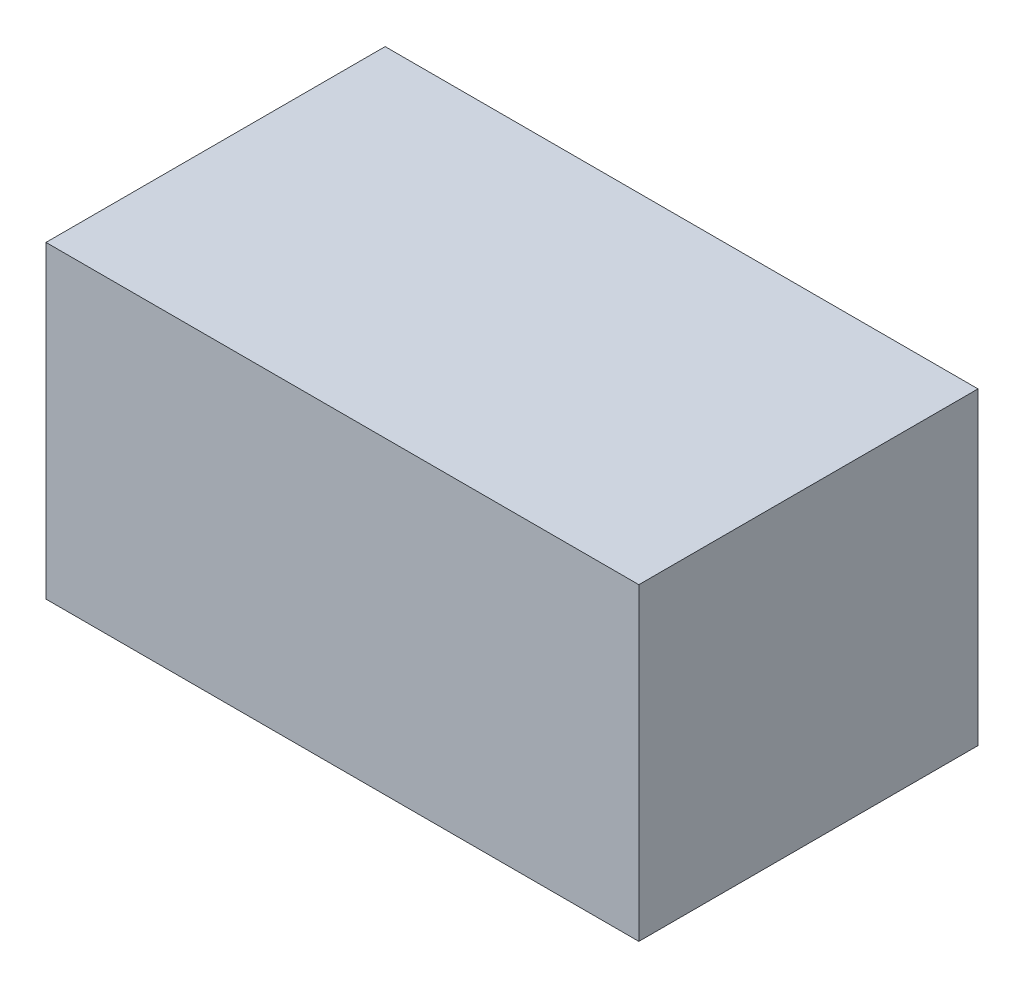
ISO-10303-21;
HEADER;
FILE_DESCRIPTION(('STEP AP214'),'2;1');
FILE_NAME('part.step','',(''),(''),'','','');
FILE_SCHEMA(('AUTOMOTIVE_DESIGN { 1 0 10303 214 1 1 1 1 }'));
ENDSEC;
DATA;
#1=APPLICATION_CONTEXT('core data for automotive mechanical design processes');
#2=APPLICATION_PROTOCOL_DEFINITION('international standard','automotive_design',2000,#1);
#3=PRODUCT_CONTEXT('',#1,'mechanical');
#4=PRODUCT('Part','Part','',(#3));
#5=PRODUCT_RELATED_PRODUCT_CATEGORY('part','',(#4));
#6=PRODUCT_DEFINITION_FORMATION('','',#4);
#7=PRODUCT_DEFINITION_CONTEXT('part definition',#1,'design');
#8=PRODUCT_DEFINITION('design','',#6,#7);
#9=PRODUCT_DEFINITION_SHAPE('','',#8);
#10=(LENGTH_UNIT() NAMED_UNIT(*) SI_UNIT(.MILLI.,.METRE.));
#11=(NAMED_UNIT(*) PLANE_ANGLE_UNIT() SI_UNIT($,.RADIAN.));
#12=(NAMED_UNIT(*) SI_UNIT($,.STERADIAN.) SOLID_ANGLE_UNIT());
#13=UNCERTAINTY_MEASURE_WITH_UNIT(LENGTH_MEASURE(1.E-05),#10,'distance_accuracy_value','');
#14=(GEOMETRIC_REPRESENTATION_CONTEXT(3) GLOBAL_UNCERTAINTY_ASSIGNED_CONTEXT((#13)) GLOBAL_UNIT_ASSIGNED_CONTEXT((#10,
#11,#12)) REPRESENTATION_CONTEXT('',''));
#15=CARTESIAN_POINT('',(0.,0.,0.));
#16=DIRECTION('',(0.,0.,1.));
#17=DIRECTION('',(1.,0.,0.));
#18=AXIS2_PLACEMENT_3D('',#15,#16,#17);
#19=CARTESIAN_POINT('',(-41.1232394366197,35.8,-16.9814788732394));
#20=DIRECTION('',(0.,0.,-1.));
#21=DIRECTION('',(-1.,0.,0.));
#22=AXIS2_PLACEMENT_3D('',#19,#20,#21);
#23=PLANE('',#22);
#24=DIRECTION('',(1.,0.,0.));
#25=VECTOR('',#24,1.);
#26=CARTESIAN_POINT('',(-41.1232394366197,0.,-16.9814788732394));
#27=LINE('',#26,#25);
#28=CARTESIAN_POINT('',(-41.1232394366197,0.,-16.9814788732394));
#29=VERTEX_POINT('',#28);
#30=CARTESIAN_POINT('',(27.5767605633803,0.,-16.9814788732394));
#31=VERTEX_POINT('',#30);
#32=EDGE_CURVE('E110',#29,#31,#27,.T.);
#33=ORIENTED_EDGE('',*,*,#32,.F.);
#34=DIRECTION('',(0.,-1.,0.));
#35=VECTOR('',#34,1.);
#36=CARTESIAN_POINT('',(-41.1232394366197,35.8,-16.9814788732394));
#37=LINE('',#36,#35);
#38=CARTESIAN_POINT('',(-41.1232394366197,35.8,-16.9814788732394));
#39=VERTEX_POINT('',#38);
#40=EDGE_CURVE('E11',#39,#29,#37,.T.);
#41=ORIENTED_EDGE('',*,*,#40,.F.);
#42=DIRECTION('',(1.,0.,0.));
#43=VECTOR('',#42,1.);
#44=CARTESIAN_POINT('',(-41.1232394366197,35.8,-16.9814788732394));
#45=LINE('',#44,#43);
#46=CARTESIAN_POINT('',(27.5767605633803,35.8,-16.9814788732394));
#47=VERTEX_POINT('',#46);
#48=EDGE_CURVE('E103',#39,#47,#45,.T.);
#49=ORIENTED_EDGE('',*,*,#48,.T.);
#50=DIRECTION('',(0.,-1.,0.));
#51=VECTOR('',#50,1.);
#52=CARTESIAN_POINT('',(27.5767605633803,35.8,-16.9814788732394));
#53=LINE('',#52,#51);
#54=EDGE_CURVE('E42',#47,#31,#53,.T.);
#55=ORIENTED_EDGE('',*,*,#54,.T.);
#56=EDGE_LOOP('',(#33,#41,#49,#55));
#57=FACE_BOUND('',#56,.T.);
#58=ADVANCED_FACE('F39',(#57),#23,.T.);
#59=CARTESIAN_POINT('',(-41.1232394366197,35.8,-16.9814788732394));
#60=DIRECTION('',(1.,0.,0.));
#61=DIRECTION('',(0.,0.,-1.));
#62=AXIS2_PLACEMENT_3D('',#59,#60,#61);
#63=PLANE('',#62);
#64=DIRECTION('',(0.,0.,1.));
#65=VECTOR('',#64,1.);
#66=CARTESIAN_POINT('',(-41.1232394366197,0.,-16.9814788732394));
#67=LINE('',#66,#65);
#68=CARTESIAN_POINT('',(-41.1232394366197,0.,22.3185211267606));
#69=VERTEX_POINT('',#68);
#70=EDGE_CURVE('E73',#29,#69,#67,.T.);
#71=ORIENTED_EDGE('',*,*,#70,.T.);
#72=DIRECTION('',(0.,-1.,0.));
#73=VECTOR('',#72,1.);
#74=CARTESIAN_POINT('',(-41.1232394366197,35.8,22.3185211267606));
#75=LINE('',#74,#73);
#76=CARTESIAN_POINT('',(-41.1232394366197,35.8,22.3185211267606));
#77=VERTEX_POINT('',#76);
#78=EDGE_CURVE('E49',#77,#69,#75,.T.);
#79=ORIENTED_EDGE('',*,*,#78,.F.);
#80=DIRECTION('',(0.,0.,1.));
#81=VECTOR('',#80,1.);
#82=CARTESIAN_POINT('',(-41.1232394366197,35.8,-16.9814788732394));
#83=LINE('',#82,#81);
#84=EDGE_CURVE('E90',#39,#77,#83,.T.);
#85=ORIENTED_EDGE('',*,*,#84,.F.);
#86=ORIENTED_EDGE('',*,*,#40,.T.);
#87=EDGE_LOOP('',(#71,#79,#85,#86));
#88=FACE_BOUND('',#87,.T.);
#89=ADVANCED_FACE('F126',(#88),#63,.F.);
#90=CARTESIAN_POINT('',(-41.1232394366197,35.8,22.3185211267606));
#91=DIRECTION('',(0.,0.,-1.));
#92=DIRECTION('',(-1.,0.,0.));
#93=AXIS2_PLACEMENT_3D('',#90,#91,#92);
#94=PLANE('',#93);
#95=DIRECTION('',(1.,0.,0.));
#96=VECTOR('',#95,1.);
#97=CARTESIAN_POINT('',(-41.1232394366197,0.,22.3185211267606));
#98=LINE('',#97,#96);
#99=CARTESIAN_POINT('',(27.5767605633803,0.,22.3185211267606));
#100=VERTEX_POINT('',#99);
#101=EDGE_CURVE('E98',#69,#100,#98,.T.);
#102=ORIENTED_EDGE('',*,*,#101,.T.);
#103=DIRECTION('',(0.,-1.,0.));
#104=VECTOR('',#103,1.);
#105=CARTESIAN_POINT('',(27.5767605633803,35.8,22.3185211267606));
#106=LINE('',#105,#104);
#107=CARTESIAN_POINT('',(27.5767605633803,35.8,22.3185211267606));
#108=VERTEX_POINT('',#107);
#109=EDGE_CURVE('E95',#108,#100,#106,.T.);
#110=ORIENTED_EDGE('',*,*,#109,.F.);
#111=DIRECTION('',(1.,0.,0.));
#112=VECTOR('',#111,1.);
#113=CARTESIAN_POINT('',(-41.1232394366197,35.8,22.3185211267606));
#114=LINE('',#113,#112);
#115=EDGE_CURVE('E85',#77,#108,#114,.T.);
#116=ORIENTED_EDGE('',*,*,#115,.F.);
#117=ORIENTED_EDGE('',*,*,#78,.T.);
#118=EDGE_LOOP('',(#102,#110,#116,#117));
#119=FACE_BOUND('',#118,.T.);
#120=ADVANCED_FACE('F96',(#119),#94,.F.);
#121=CARTESIAN_POINT('',(27.5767605633803,35.8,-16.9814788732394));
#122=DIRECTION('',(1.,0.,0.));
#123=DIRECTION('',(0.,0.,-1.));
#124=AXIS2_PLACEMENT_3D('',#121,#122,#123);
#125=PLANE('',#124);
#126=DIRECTION('',(0.,0.,1.));
#127=VECTOR('',#126,1.);
#128=CARTESIAN_POINT('',(27.5767605633803,0.,-16.9814788732394));
#129=LINE('',#128,#127);
#130=EDGE_CURVE('E114',#31,#100,#129,.T.);
#131=ORIENTED_EDGE('',*,*,#130,.F.);
#132=ORIENTED_EDGE('',*,*,#54,.F.);
#133=DIRECTION('',(0.,0.,1.));
#134=VECTOR('',#133,1.);
#135=CARTESIAN_POINT('',(27.5767605633803,35.8,-16.9814788732394));
#136=LINE('',#135,#134);
#137=EDGE_CURVE('E89',#47,#108,#136,.T.);
#138=ORIENTED_EDGE('',*,*,#137,.T.);
#139=ORIENTED_EDGE('',*,*,#109,.T.);
#140=EDGE_LOOP('',(#131,#132,#138,#139));
#141=FACE_BOUND('',#140,.T.);
#142=ADVANCED_FACE('F101',(#141),#125,.T.);
#143=CARTESIAN_POINT('',(0.,35.8,0.));
#144=DIRECTION('',(0.,-1.,0.));
#145=DIRECTION('',(0.,0.,-1.));
#146=AXIS2_PLACEMENT_3D('',#143,#144,#145);
#147=PLANE('',#146);
#148=ORIENTED_EDGE('',*,*,#48,.F.);
#149=ORIENTED_EDGE('',*,*,#84,.T.);
#150=ORIENTED_EDGE('',*,*,#115,.T.);
#151=ORIENTED_EDGE('',*,*,#137,.F.);
#152=EDGE_LOOP('',(#148,#149,#150,#151));
#153=FACE_BOUND('',#152,.T.);
#154=ADVANCED_FACE('F88',(#153),#147,.F.);
#155=CARTESIAN_POINT('',(0.,0.,0.));
#156=DIRECTION('',(0.,-1.,0.));
#157=DIRECTION('',(0.,0.,-1.));
#158=AXIS2_PLACEMENT_3D('',#155,#156,#157);
#159=PLANE('',#158);
#160=ORIENTED_EDGE('',*,*,#32,.T.);
#161=ORIENTED_EDGE('',*,*,#130,.T.);
#162=ORIENTED_EDGE('',*,*,#101,.F.);
#163=ORIENTED_EDGE('',*,*,#70,.F.);
#164=EDGE_LOOP('',(#160,#161,#162,#163));
#165=FACE_BOUND('',#164,.T.);
#166=ADVANCED_FACE('F123',(#165),#159,.T.);
#167=CLOSED_SHELL('',(#58,#89,#120,#142,#154,#166));
#168=MANIFOLD_SOLID_BREP('B2',#167);
#169=ADVANCED_BREP_SHAPE_REPRESENTATION('',(#18,#168),#14);
#170=SHAPE_DEFINITION_REPRESENTATION(#9,#169);
ENDSEC;
END-ISO-10303-21;
